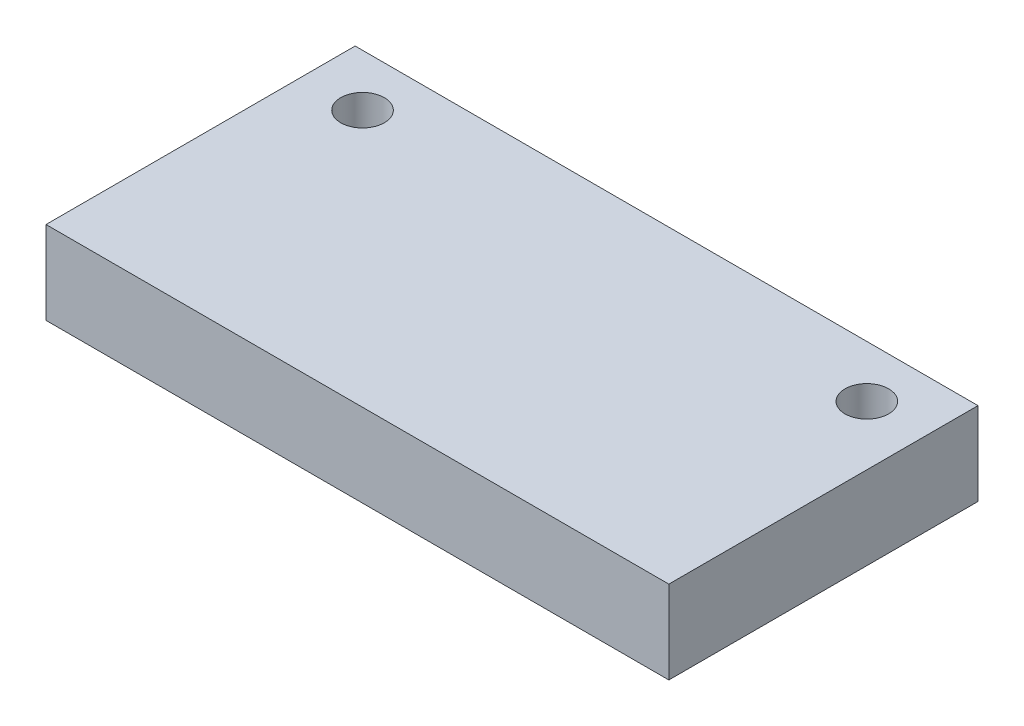
ISO-10303-21;
HEADER;
FILE_DESCRIPTION(('STEP AP214'),'2;1');
FILE_NAME('part.step','',(''),(''),'','','');
FILE_SCHEMA(('AUTOMOTIVE_DESIGN { 1 0 10303 214 1 1 1 1 }'));
ENDSEC;
DATA;
#1=APPLICATION_CONTEXT('core data for automotive mechanical design processes');
#2=APPLICATION_PROTOCOL_DEFINITION('international standard','automotive_design',2000,#1);
#3=PRODUCT_CONTEXT('',#1,'mechanical');
#4=PRODUCT('Part','Part','',(#3));
#5=PRODUCT_RELATED_PRODUCT_CATEGORY('part','',(#4));
#6=PRODUCT_DEFINITION_FORMATION('','',#4);
#7=PRODUCT_DEFINITION_CONTEXT('part definition',#1,'design');
#8=PRODUCT_DEFINITION('design','',#6,#7);
#9=PRODUCT_DEFINITION_SHAPE('','',#8);
#10=(LENGTH_UNIT() NAMED_UNIT(*) SI_UNIT(.MILLI.,.METRE.));
#11=(NAMED_UNIT(*) PLANE_ANGLE_UNIT() SI_UNIT($,.RADIAN.));
#12=(NAMED_UNIT(*) SI_UNIT($,.STERADIAN.) SOLID_ANGLE_UNIT());
#13=UNCERTAINTY_MEASURE_WITH_UNIT(LENGTH_MEASURE(1.E-05),#10,'distance_accuracy_value','');
#14=(GEOMETRIC_REPRESENTATION_CONTEXT(3) GLOBAL_UNCERTAINTY_ASSIGNED_CONTEXT((#13)) GLOBAL_UNIT_ASSIGNED_CONTEXT((#10,
#11,#12)) REPRESENTATION_CONTEXT('',''));
#15=CARTESIAN_POINT('',(0.,0.,0.));
#16=DIRECTION('',(0.,0.,1.));
#17=DIRECTION('',(1.,0.,0.));
#18=AXIS2_PLACEMENT_3D('',#15,#16,#17);
#19=CARTESIAN_POINT('',(-15.,4.,0.));
#20=DIRECTION('',(-1.,0.,0.));
#21=DIRECTION('',(0.,0.,1.));
#22=AXIS2_PLACEMENT_3D('',#19,#20,#21);
#23=PLANE('',#22);
#24=DIRECTION('',(0.,0.,-1.));
#25=VECTOR('',#24,1.);
#26=CARTESIAN_POINT('',(-15.,0.,0.));
#27=LINE('',#26,#25);
#28=CARTESIAN_POINT('',(-15.,0.,12.3909759219865));
#29=VERTEX_POINT('',#28);
#30=CARTESIAN_POINT('',(-15.,0.,-2.5));
#31=VERTEX_POINT('',#30);
#32=EDGE_CURVE('E123',#29,#31,#27,.T.);
#33=ORIENTED_EDGE('',*,*,#32,.F.);
#34=DIRECTION('',(0.,-1.,0.));
#35=VECTOR('',#34,1.);
#36=CARTESIAN_POINT('',(-15.,4.,12.3909759219865));
#37=LINE('',#36,#35);
#38=CARTESIAN_POINT('',(-15.,4.,12.3909759219865));
#39=VERTEX_POINT('',#38);
#40=EDGE_CURVE('E11',#39,#29,#37,.T.);
#41=ORIENTED_EDGE('',*,*,#40,.F.);
#42=DIRECTION('',(0.,0.,-1.));
#43=VECTOR('',#42,1.);
#44=CARTESIAN_POINT('',(-15.,4.,0.));
#45=LINE('',#44,#43);
#46=CARTESIAN_POINT('',(-15.,4.,-2.5));
#47=VERTEX_POINT('',#46);
#48=EDGE_CURVE('E100',#39,#47,#45,.T.);
#49=ORIENTED_EDGE('',*,*,#48,.T.);
#50=DIRECTION('',(0.,-1.,0.));
#51=VECTOR('',#50,1.);
#52=CARTESIAN_POINT('',(-15.,4.,-2.5));
#53=LINE('',#52,#51);
#54=EDGE_CURVE('E61',#47,#31,#53,.T.);
#55=ORIENTED_EDGE('',*,*,#54,.T.);
#56=EDGE_LOOP('',(#33,#41,#49,#55));
#57=FACE_BOUND('',#56,.T.);
#58=ADVANCED_FACE('F43',(#57),#23,.T.);
#59=CARTESIAN_POINT('',(0.,4.,12.3909759219865));
#60=DIRECTION('',(0.,0.,-1.));
#61=DIRECTION('',(-1.,0.,0.));
#62=AXIS2_PLACEMENT_3D('',#59,#60,#61);
#63=PLANE('',#62);
#64=DIRECTION('',(1.,0.,0.));
#65=VECTOR('',#64,1.);
#66=CARTESIAN_POINT('',(0.,0.,12.3909759219865));
#67=LINE('',#66,#65);
#68=CARTESIAN_POINT('',(15.,0.,12.3909759219865));
#69=VERTEX_POINT('',#68);
#70=EDGE_CURVE('E106',#29,#69,#67,.T.);
#71=ORIENTED_EDGE('',*,*,#70,.T.);
#72=DIRECTION('',(0.,-1.,0.));
#73=VECTOR('',#72,1.);
#74=CARTESIAN_POINT('',(15.,4.,12.3909759219865));
#75=LINE('',#74,#73);
#76=CARTESIAN_POINT('',(15.,4.,12.3909759219865));
#77=VERTEX_POINT('',#76);
#78=EDGE_CURVE('E53',#77,#69,#75,.T.);
#79=ORIENTED_EDGE('',*,*,#78,.F.);
#80=DIRECTION('',(1.,0.,0.));
#81=VECTOR('',#80,1.);
#82=CARTESIAN_POINT('',(0.,4.,12.3909759219865));
#83=LINE('',#82,#81);
#84=EDGE_CURVE('E96',#39,#77,#83,.T.);
#85=ORIENTED_EDGE('',*,*,#84,.F.);
#86=ORIENTED_EDGE('',*,*,#40,.T.);
#87=EDGE_LOOP('',(#71,#79,#85,#86));
#88=FACE_BOUND('',#87,.T.);
#89=ADVANCED_FACE('F104',(#88),#63,.F.);
#90=CARTESIAN_POINT('',(15.,4.,0.));
#91=DIRECTION('',(-1.,0.,0.));
#92=DIRECTION('',(0.,0.,1.));
#93=AXIS2_PLACEMENT_3D('',#90,#91,#92);
#94=PLANE('',#93);
#95=DIRECTION('',(0.,0.,-1.));
#96=VECTOR('',#95,1.);
#97=CARTESIAN_POINT('',(15.,0.,0.));
#98=LINE('',#97,#96);
#99=CARTESIAN_POINT('',(15.,0.,-2.5));
#100=VERTEX_POINT('',#99);
#101=EDGE_CURVE('E118',#69,#100,#98,.T.);
#102=ORIENTED_EDGE('',*,*,#101,.T.);
#103=DIRECTION('',(0.,-1.,0.));
#104=VECTOR('',#103,1.);
#105=CARTESIAN_POINT('',(15.,4.,-2.5));
#106=LINE('',#105,#104);
#107=CARTESIAN_POINT('',(15.,4.,-2.5));
#108=VERTEX_POINT('',#107);
#109=EDGE_CURVE('E75',#108,#100,#106,.T.);
#110=ORIENTED_EDGE('',*,*,#109,.F.);
#111=DIRECTION('',(0.,0.,-1.));
#112=VECTOR('',#111,1.);
#113=CARTESIAN_POINT('',(15.,4.,0.));
#114=LINE('',#113,#112);
#115=EDGE_CURVE('E87',#77,#108,#114,.T.);
#116=ORIENTED_EDGE('',*,*,#115,.F.);
#117=ORIENTED_EDGE('',*,*,#78,.T.);
#118=EDGE_LOOP('',(#102,#110,#116,#117));
#119=FACE_BOUND('',#118,.T.);
#120=ADVANCED_FACE('F89',(#119),#94,.F.);
#121=CARTESIAN_POINT('',(-12.1449485,4.,0.));
#122=DIRECTION('',(0.,-1.,0.));
#123=DIRECTION('',(0.,0.,-1.));
#124=AXIS2_PLACEMENT_3D('',#121,#122,#123);
#125=CYLINDRICAL_SURFACE('',#124,1.05);
#126=CARTESIAN_POINT('',(-12.1449485,4.,0.));
#127=DIRECTION('',(0.,1.,0.));
#128=DIRECTION('',(0.,0.,1.));
#129=AXIS2_PLACEMENT_3D('',#126,#127,#128);
#130=CIRCLE('',#129,1.05);
#131=CARTESIAN_POINT('',(-12.1449485,4.,1.05));
#132=VERTEX_POINT('',#131);
#133=EDGE_CURVE('E138',#132,#132,#130,.T.);
#134=ORIENTED_EDGE('',*,*,#133,.T.);
#135=EDGE_LOOP('',(#134));
#136=FACE_BOUND('',#135,.T.);
#137=CARTESIAN_POINT('',(-12.1449485,0.,0.));
#138=DIRECTION('',(0.,1.,0.));
#139=DIRECTION('',(0.,0.,1.));
#140=AXIS2_PLACEMENT_3D('',#137,#138,#139);
#141=CIRCLE('',#140,1.05);
#142=CARTESIAN_POINT('',(-12.1449485,0.,1.05));
#143=VERTEX_POINT('',#142);
#144=EDGE_CURVE('E126',#143,#143,#141,.T.);
#145=ORIENTED_EDGE('',*,*,#144,.F.);
#146=EDGE_LOOP('',(#145));
#147=FACE_BOUND('',#146,.T.);
#148=ADVANCED_FACE('F155',(#136,#147),#125,.F.);
#149=CARTESIAN_POINT('',(12.1449485,4.,0.));
#150=DIRECTION('',(0.,-1.,0.));
#151=DIRECTION('',(0.,0.,-1.));
#152=AXIS2_PLACEMENT_3D('',#149,#150,#151);
#153=CYLINDRICAL_SURFACE('',#152,1.05);
#154=CARTESIAN_POINT('',(12.1449485,4.,0.));
#155=DIRECTION('',(0.,1.,0.));
#156=DIRECTION('',(0.,0.,1.));
#157=AXIS2_PLACEMENT_3D('',#154,#155,#156);
#158=CIRCLE('',#157,1.05);
#159=CARTESIAN_POINT('',(12.1449485,4.,1.05));
#160=VERTEX_POINT('',#159);
#161=EDGE_CURVE('E117',#160,#160,#158,.T.);
#162=ORIENTED_EDGE('',*,*,#161,.T.);
#163=EDGE_LOOP('',(#162));
#164=FACE_BOUND('',#163,.T.);
#165=CARTESIAN_POINT('',(12.1449485,0.,0.));
#166=DIRECTION('',(0.,1.,0.));
#167=DIRECTION('',(0.,0.,1.));
#168=AXIS2_PLACEMENT_3D('',#165,#166,#167);
#169=CIRCLE('',#168,1.05);
#170=CARTESIAN_POINT('',(12.1449485,0.,1.05));
#171=VERTEX_POINT('',#170);
#172=EDGE_CURVE('E130',#171,#171,#169,.T.);
#173=ORIENTED_EDGE('',*,*,#172,.F.);
#174=EDGE_LOOP('',(#173));
#175=FACE_BOUND('',#174,.T.);
#176=ADVANCED_FACE('F45',(#164,#175),#153,.F.);
#177=CARTESIAN_POINT('',(0.,4.,-2.5));
#178=DIRECTION('',(0.,0.,-1.));
#179=DIRECTION('',(-1.,0.,0.));
#180=AXIS2_PLACEMENT_3D('',#177,#178,#179);
#181=PLANE('',#180);
#182=DIRECTION('',(1.,0.,0.));
#183=VECTOR('',#182,1.);
#184=CARTESIAN_POINT('',(0.,0.,-2.5));
#185=LINE('',#184,#183);
#186=EDGE_CURVE('E113',#31,#100,#185,.T.);
#187=ORIENTED_EDGE('',*,*,#186,.F.);
#188=ORIENTED_EDGE('',*,*,#54,.F.);
#189=DIRECTION('',(1.,0.,0.));
#190=VECTOR('',#189,1.);
#191=CARTESIAN_POINT('',(0.,4.,-2.5));
#192=LINE('',#191,#190);
#193=EDGE_CURVE('E95',#47,#108,#192,.T.);
#194=ORIENTED_EDGE('',*,*,#193,.T.);
#195=ORIENTED_EDGE('',*,*,#109,.T.);
#196=EDGE_LOOP('',(#187,#188,#194,#195));
#197=FACE_BOUND('',#196,.T.);
#198=ADVANCED_FACE('F151',(#197),#181,.T.);
#199=CARTESIAN_POINT('',(0.,4.,0.));
#200=DIRECTION('',(0.,1.,0.));
#201=DIRECTION('',(0.,0.,1.));
#202=AXIS2_PLACEMENT_3D('',#199,#200,#201);
#203=PLANE('',#202);
#204=ORIENTED_EDGE('',*,*,#161,.F.);
#205=EDGE_LOOP('',(#204));
#206=FACE_BOUND('',#205,.T.);
#207=ORIENTED_EDGE('',*,*,#133,.F.);
#208=EDGE_LOOP('',(#207));
#209=FACE_BOUND('',#208,.T.);
#210=ORIENTED_EDGE('',*,*,#48,.F.);
#211=ORIENTED_EDGE('',*,*,#84,.T.);
#212=ORIENTED_EDGE('',*,*,#115,.T.);
#213=ORIENTED_EDGE('',*,*,#193,.F.);
#214=EDGE_LOOP('',(#210,#211,#212,#213));
#215=FACE_BOUND('',#214,.T.);
#216=ADVANCED_FACE('F99',(#206,#209,#215),#203,.T.);
#217=CARTESIAN_POINT('',(0.,0.,0.));
#218=DIRECTION('',(0.,1.,0.));
#219=DIRECTION('',(0.,0.,1.));
#220=AXIS2_PLACEMENT_3D('',#217,#218,#219);
#221=PLANE('',#220);
#222=ORIENTED_EDGE('',*,*,#172,.T.);
#223=EDGE_LOOP('',(#222));
#224=FACE_BOUND('',#223,.T.);
#225=ORIENTED_EDGE('',*,*,#144,.T.);
#226=EDGE_LOOP('',(#225));
#227=FACE_BOUND('',#226,.T.);
#228=ORIENTED_EDGE('',*,*,#32,.T.);
#229=ORIENTED_EDGE('',*,*,#186,.T.);
#230=ORIENTED_EDGE('',*,*,#101,.F.);
#231=ORIENTED_EDGE('',*,*,#70,.F.);
#232=EDGE_LOOP('',(#228,#229,#230,#231));
#233=FACE_BOUND('',#232,.T.);
#234=ADVANCED_FACE('F150',(#224,#227,#233),#221,.F.);
#235=CLOSED_SHELL('',(#58,#89,#120,#148,#176,#198,#216,#234));
#236=MANIFOLD_SOLID_BREP('B2',#235);
#237=ADVANCED_BREP_SHAPE_REPRESENTATION('',(#18,#236),#14);
#238=SHAPE_DEFINITION_REPRESENTATION(#9,#237);
ENDSEC;
END-ISO-10303-21;
